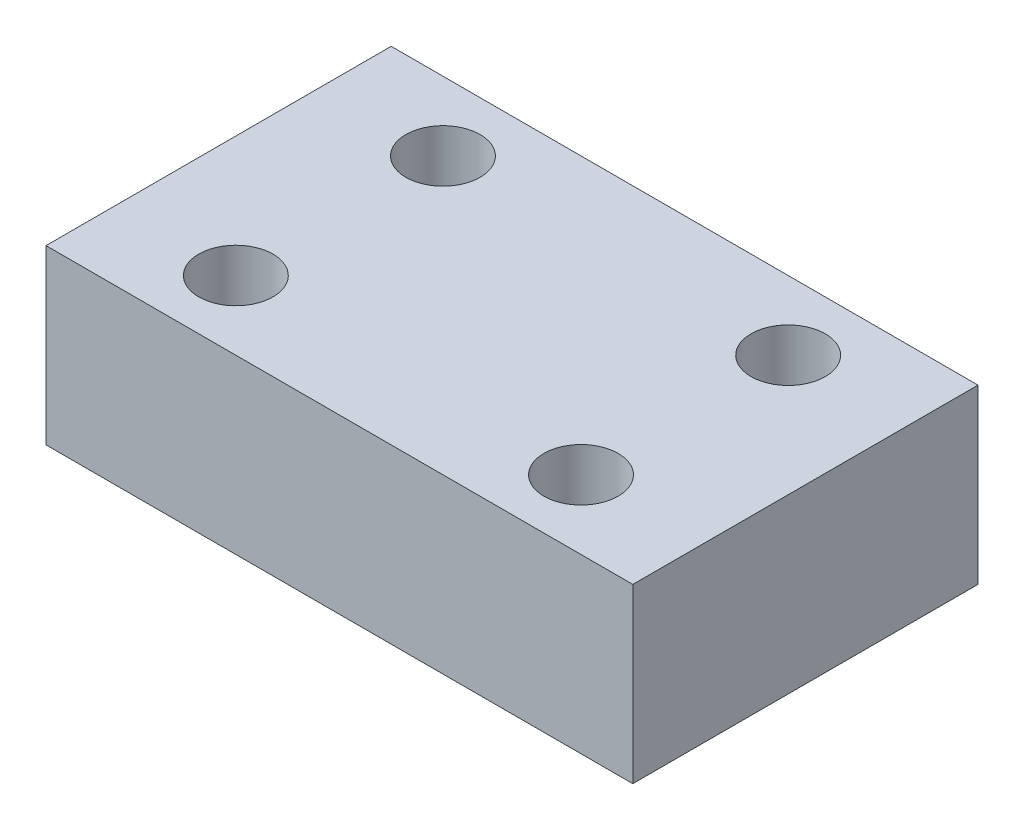
ISO-10303-21;
HEADER;
FILE_DESCRIPTION(('STEP AP214'),'2;1');
FILE_NAME('part.step','',(''),(''),'','','');
FILE_SCHEMA(('AUTOMOTIVE_DESIGN { 1 0 10303 214 1 1 1 1 }'));
ENDSEC;
DATA;
#1=APPLICATION_CONTEXT('core data for automotive mechanical design processes');
#2=APPLICATION_PROTOCOL_DEFINITION('international standard','automotive_design',2000,#1);
#3=PRODUCT_CONTEXT('',#1,'mechanical');
#4=PRODUCT('Part','Part','',(#3));
#5=PRODUCT_RELATED_PRODUCT_CATEGORY('part','',(#4));
#6=PRODUCT_DEFINITION_FORMATION('','',#4);
#7=PRODUCT_DEFINITION_CONTEXT('part definition',#1,'design');
#8=PRODUCT_DEFINITION('design','',#6,#7);
#9=PRODUCT_DEFINITION_SHAPE('','',#8);
#10=(LENGTH_UNIT() NAMED_UNIT(*) SI_UNIT(.MILLI.,.METRE.));
#11=(NAMED_UNIT(*) PLANE_ANGLE_UNIT() SI_UNIT($,.RADIAN.));
#12=(NAMED_UNIT(*) SI_UNIT($,.STERADIAN.) SOLID_ANGLE_UNIT());
#13=UNCERTAINTY_MEASURE_WITH_UNIT(LENGTH_MEASURE(1.E-05),#10,'distance_accuracy_value','');
#14=(GEOMETRIC_REPRESENTATION_CONTEXT(3) GLOBAL_UNCERTAINTY_ASSIGNED_CONTEXT((#13)) GLOBAL_UNIT_ASSIGNED_CONTEXT((#10,
#11,#12)) REPRESENTATION_CONTEXT('',''));
#15=CARTESIAN_POINT('',(0.,0.,0.));
#16=DIRECTION('',(0.,0.,1.));
#17=DIRECTION('',(1.,0.,0.));
#18=AXIS2_PLACEMENT_3D('',#15,#16,#17);
#19=CARTESIAN_POINT('',(-17.,-10.,-10.));
#20=DIRECTION('',(-1.,0.,0.));
#21=DIRECTION('',(0.,0.,1.));
#22=AXIS2_PLACEMENT_3D('',#19,#20,#21);
#23=PLANE('',#22);
#24=DIRECTION('',(0.,0.,1.));
#25=VECTOR('',#24,1.);
#26=CARTESIAN_POINT('',(-17.,0.,-10.));
#27=LINE('',#26,#25);
#28=CARTESIAN_POINT('',(-17.,0.,-10.));
#29=VERTEX_POINT('',#28);
#30=CARTESIAN_POINT('',(-17.,0.,10.));
#31=VERTEX_POINT('',#30);
#32=EDGE_CURVE('E102',#29,#31,#27,.T.);
#33=ORIENTED_EDGE('',*,*,#32,.F.);
#34=DIRECTION('',(0.,1.,0.));
#35=VECTOR('',#34,1.);
#36=CARTESIAN_POINT('',(-17.,-10.,-10.));
#37=LINE('',#36,#35);
#38=CARTESIAN_POINT('',(-17.,-10.,-10.));
#39=VERTEX_POINT('',#38);
#40=EDGE_CURVE('E11',#39,#29,#37,.T.);
#41=ORIENTED_EDGE('',*,*,#40,.F.);
#42=DIRECTION('',(0.,0.,1.));
#43=VECTOR('',#42,1.);
#44=CARTESIAN_POINT('',(-17.,-10.,-10.));
#45=LINE('',#44,#43);
#46=CARTESIAN_POINT('',(-17.,-10.,10.));
#47=VERTEX_POINT('',#46);
#48=EDGE_CURVE('E95',#39,#47,#45,.T.);
#49=ORIENTED_EDGE('',*,*,#48,.T.);
#50=DIRECTION('',(0.,1.,0.));
#51=VECTOR('',#50,1.);
#52=CARTESIAN_POINT('',(-17.,-10.,10.));
#53=LINE('',#52,#51);
#54=EDGE_CURVE('E40',#47,#31,#53,.T.);
#55=ORIENTED_EDGE('',*,*,#54,.T.);
#56=EDGE_LOOP('',(#33,#41,#49,#55));
#57=FACE_BOUND('',#56,.T.);
#58=ADVANCED_FACE('F37',(#57),#23,.T.);
#59=CARTESIAN_POINT('',(-17.,-10.,-10.));
#60=DIRECTION('',(0.,0.,-1.));
#61=DIRECTION('',(-1.,0.,0.));
#62=AXIS2_PLACEMENT_3D('',#59,#60,#61);
#63=PLANE('',#62);
#64=DIRECTION('',(-1.,0.,0.));
#65=VECTOR('',#64,1.);
#66=CARTESIAN_POINT('',(-17.,0.,-10.));
#67=LINE('',#66,#65);
#68=CARTESIAN_POINT('',(17.,0.,-10.));
#69=VERTEX_POINT('',#68);
#70=EDGE_CURVE('E97',#69,#29,#67,.T.);
#71=ORIENTED_EDGE('',*,*,#70,.F.);
#72=DIRECTION('',(0.,1.,0.));
#73=VECTOR('',#72,1.);
#74=CARTESIAN_POINT('',(17.,-10.,-10.));
#75=LINE('',#74,#73);
#76=CARTESIAN_POINT('',(17.,-10.,-10.));
#77=VERTEX_POINT('',#76);
#78=EDGE_CURVE('E46',#77,#69,#75,.T.);
#79=ORIENTED_EDGE('',*,*,#78,.F.);
#80=DIRECTION('',(-1.,0.,0.));
#81=VECTOR('',#80,1.);
#82=CARTESIAN_POINT('',(-17.,-10.,-10.));
#83=LINE('',#82,#81);
#84=EDGE_CURVE('E92',#77,#39,#83,.T.);
#85=ORIENTED_EDGE('',*,*,#84,.T.);
#86=ORIENTED_EDGE('',*,*,#40,.T.);
#87=EDGE_LOOP('',(#71,#79,#85,#86));
#88=FACE_BOUND('',#87,.T.);
#89=ADVANCED_FACE('F113',(#88),#63,.T.);
#90=CARTESIAN_POINT('',(17.,-10.,-10.));
#91=DIRECTION('',(1.,0.,0.));
#92=DIRECTION('',(0.,0.,-1.));
#93=AXIS2_PLACEMENT_3D('',#90,#91,#92);
#94=PLANE('',#93);
#95=DIRECTION('',(0.,0.,-1.));
#96=VECTOR('',#95,1.);
#97=CARTESIAN_POINT('',(17.,0.,-10.));
#98=LINE('',#97,#96);
#99=CARTESIAN_POINT('',(17.,0.,10.));
#100=VERTEX_POINT('',#99);
#101=EDGE_CURVE('E87',#100,#69,#98,.T.);
#102=ORIENTED_EDGE('',*,*,#101,.F.);
#103=DIRECTION('',(0.,1.,0.));
#104=VECTOR('',#103,1.);
#105=CARTESIAN_POINT('',(17.,-10.,10.));
#106=LINE('',#105,#104);
#107=CARTESIAN_POINT('',(17.,-10.,10.));
#108=VERTEX_POINT('',#107);
#109=EDGE_CURVE('E82',#108,#100,#106,.T.);
#110=ORIENTED_EDGE('',*,*,#109,.F.);
#111=DIRECTION('',(0.,0.,-1.));
#112=VECTOR('',#111,1.);
#113=CARTESIAN_POINT('',(17.,-10.,-10.));
#114=LINE('',#113,#112);
#115=EDGE_CURVE('E85',#108,#77,#114,.T.);
#116=ORIENTED_EDGE('',*,*,#115,.T.);
#117=ORIENTED_EDGE('',*,*,#78,.T.);
#118=EDGE_LOOP('',(#102,#110,#116,#117));
#119=FACE_BOUND('',#118,.T.);
#120=ADVANCED_FACE('F84',(#119),#94,.T.);
#121=CARTESIAN_POINT('',(-17.,-10.,10.));
#122=DIRECTION('',(0.,0.,1.));
#123=DIRECTION('',(1.,0.,0.));
#124=AXIS2_PLACEMENT_3D('',#121,#122,#123);
#125=PLANE('',#124);
#126=DIRECTION('',(1.,0.,0.));
#127=VECTOR('',#126,1.);
#128=CARTESIAN_POINT('',(-17.,0.,10.));
#129=LINE('',#128,#127);
#130=EDGE_CURVE('E105',#31,#100,#129,.T.);
#131=ORIENTED_EDGE('',*,*,#130,.F.);
#132=ORIENTED_EDGE('',*,*,#54,.F.);
#133=DIRECTION('',(1.,0.,0.));
#134=VECTOR('',#133,1.);
#135=CARTESIAN_POINT('',(-17.,-10.,10.));
#136=LINE('',#135,#134);
#137=EDGE_CURVE('E91',#47,#108,#136,.T.);
#138=ORIENTED_EDGE('',*,*,#137,.T.);
#139=ORIENTED_EDGE('',*,*,#109,.T.);
#140=EDGE_LOOP('',(#131,#132,#138,#139));
#141=FACE_BOUND('',#140,.T.);
#142=ADVANCED_FACE('F94',(#141),#125,.T.);
#143=CARTESIAN_POINT('',(0.,-10.,0.));
#144=DIRECTION('',(0.,1.,0.));
#145=DIRECTION('',(0.,0.,1.));
#146=AXIS2_PLACEMENT_3D('',#143,#144,#145);
#147=PLANE('',#146);
#148=CARTESIAN_POINT('',(-10.,-10.,-6.));
#149=DIRECTION('',(0.,1.,0.));
#150=DIRECTION('',(0.,0.,1.));
#151=AXIS2_PLACEMENT_3D('',#148,#149,#150);
#152=CIRCLE('',#151,2.15);
#153=CARTESIAN_POINT('',(-10.,-10.,-3.85));
#154=VERTEX_POINT('',#153);
#155=EDGE_CURVE('E154',#154,#154,#152,.T.);
#156=ORIENTED_EDGE('',*,*,#155,.T.);
#157=EDGE_LOOP('',(#156));
#158=FACE_BOUND('',#157,.T.);
#159=CARTESIAN_POINT('',(-10.,-10.,6.));
#160=DIRECTION('',(0.,1.,0.));
#161=DIRECTION('',(0.,0.,1.));
#162=AXIS2_PLACEMENT_3D('',#159,#160,#161);
#163=CIRCLE('',#162,2.15);
#164=CARTESIAN_POINT('',(-10.,-10.,8.15));
#165=VERTEX_POINT('',#164);
#166=EDGE_CURVE('E164',#165,#165,#163,.T.);
#167=ORIENTED_EDGE('',*,*,#166,.T.);
#168=EDGE_LOOP('',(#167));
#169=FACE_BOUND('',#168,.T.);
#170=CARTESIAN_POINT('',(10.,-10.,6.));
#171=DIRECTION('',(0.,1.,0.));
#172=DIRECTION('',(0.,0.,1.));
#173=AXIS2_PLACEMENT_3D('',#170,#171,#172);
#174=CIRCLE('',#173,2.15);
#175=CARTESIAN_POINT('',(10.,-10.,8.15));
#176=VERTEX_POINT('',#175);
#177=EDGE_CURVE('E170',#176,#176,#174,.T.);
#178=ORIENTED_EDGE('',*,*,#177,.T.);
#179=EDGE_LOOP('',(#178));
#180=FACE_BOUND('',#179,.T.);
#181=CARTESIAN_POINT('',(10.,-10.,-6.));
#182=DIRECTION('',(0.,1.,0.));
#183=DIRECTION('',(0.,0.,1.));
#184=AXIS2_PLACEMENT_3D('',#181,#182,#183);
#185=CIRCLE('',#184,2.15);
#186=CARTESIAN_POINT('',(10.,-10.,-3.85));
#187=VERTEX_POINT('',#186);
#188=EDGE_CURVE('E106',#187,#187,#185,.T.);
#189=ORIENTED_EDGE('',*,*,#188,.T.);
#190=EDGE_LOOP('',(#189));
#191=FACE_BOUND('',#190,.T.);
#192=ORIENTED_EDGE('',*,*,#48,.F.);
#193=ORIENTED_EDGE('',*,*,#84,.F.);
#194=ORIENTED_EDGE('',*,*,#115,.F.);
#195=ORIENTED_EDGE('',*,*,#137,.F.);
#196=EDGE_LOOP('',(#192,#193,#194,#195));
#197=FACE_BOUND('',#196,.T.);
#198=ADVANCED_FACE('F90',(#158,#169,#180,#191,#197),#147,.F.);
#199=CARTESIAN_POINT('',(0.,0.,0.));
#200=DIRECTION('',(0.,1.,0.));
#201=DIRECTION('',(0.,0.,1.));
#202=AXIS2_PLACEMENT_3D('',#199,#200,#201);
#203=PLANE('',#202);
#204=CARTESIAN_POINT('',(-10.,0.,-6.));
#205=DIRECTION('',(0.,1.,0.));
#206=DIRECTION('',(0.,0.,1.));
#207=AXIS2_PLACEMENT_3D('',#204,#205,#206);
#208=CIRCLE('',#207,2.14999999999999);
#209=CARTESIAN_POINT('',(-10.,0.,-3.85000000000001));
#210=VERTEX_POINT('',#209);
#211=EDGE_CURVE('E157',#210,#210,#208,.T.);
#212=ORIENTED_EDGE('',*,*,#211,.F.);
#213=EDGE_LOOP('',(#212));
#214=FACE_BOUND('',#213,.T.);
#215=CARTESIAN_POINT('',(-10.,0.,6.));
#216=DIRECTION('',(0.,1.,0.));
#217=DIRECTION('',(0.,0.,1.));
#218=AXIS2_PLACEMENT_3D('',#215,#216,#217);
#219=CIRCLE('',#218,2.14999999999999);
#220=CARTESIAN_POINT('',(-10.,0.,8.14999999999999));
#221=VERTEX_POINT('',#220);
#222=EDGE_CURVE('E159',#221,#221,#219,.T.);
#223=ORIENTED_EDGE('',*,*,#222,.F.);
#224=EDGE_LOOP('',(#223));
#225=FACE_BOUND('',#224,.T.);
#226=CARTESIAN_POINT('',(10.,0.,6.));
#227=DIRECTION('',(0.,1.,0.));
#228=DIRECTION('',(0.,0.,1.));
#229=AXIS2_PLACEMENT_3D('',#226,#227,#228);
#230=CIRCLE('',#229,2.14999999999999);
#231=CARTESIAN_POINT('',(10.,0.,8.14999999999999));
#232=VERTEX_POINT('',#231);
#233=EDGE_CURVE('E167',#232,#232,#230,.T.);
#234=ORIENTED_EDGE('',*,*,#233,.F.);
#235=EDGE_LOOP('',(#234));
#236=FACE_BOUND('',#235,.T.);
#237=CARTESIAN_POINT('',(10.,0.,-6.));
#238=DIRECTION('',(0.,1.,0.));
#239=DIRECTION('',(0.,0.,1.));
#240=AXIS2_PLACEMENT_3D('',#237,#238,#239);
#241=CIRCLE('',#240,2.14999999999999);
#242=CARTESIAN_POINT('',(10.,0.,-3.85000000000001));
#243=VERTEX_POINT('',#242);
#244=EDGE_CURVE('E173',#243,#243,#241,.T.);
#245=ORIENTED_EDGE('',*,*,#244,.F.);
#246=EDGE_LOOP('',(#245));
#247=FACE_BOUND('',#246,.T.);
#248=ORIENTED_EDGE('',*,*,#32,.T.);
#249=ORIENTED_EDGE('',*,*,#130,.T.);
#250=ORIENTED_EDGE('',*,*,#101,.T.);
#251=ORIENTED_EDGE('',*,*,#70,.T.);
#252=EDGE_LOOP('',(#248,#249,#250,#251));
#253=FACE_BOUND('',#252,.T.);
#254=ADVANCED_FACE('F112',(#214,#225,#236,#247,#253),#203,.T.);
#255=CARTESIAN_POINT('',(10.,0.,-6.));
#256=DIRECTION('',(0.,1.,0.));
#257=DIRECTION('',(0.,0.,1.));
#258=AXIS2_PLACEMENT_3D('',#255,#256,#257);
#259=CYLINDRICAL_SURFACE('',#258,2.14999999999999);
#260=ORIENTED_EDGE('',*,*,#188,.F.);
#261=EDGE_LOOP('',(#260));
#262=FACE_BOUND('',#261,.T.);
#263=ORIENTED_EDGE('',*,*,#244,.T.);
#264=EDGE_LOOP('',(#263));
#265=FACE_BOUND('',#264,.T.);
#266=ADVANCED_FACE('F131',(#262,#265),#259,.F.);
#267=CARTESIAN_POINT('',(10.,0.,6.));
#268=DIRECTION('',(0.,1.,0.));
#269=DIRECTION('',(0.,0.,1.));
#270=AXIS2_PLACEMENT_3D('',#267,#268,#269);
#271=CYLINDRICAL_SURFACE('',#270,2.14999999999999);
#272=ORIENTED_EDGE('',*,*,#177,.F.);
#273=EDGE_LOOP('',(#272));
#274=FACE_BOUND('',#273,.T.);
#275=ORIENTED_EDGE('',*,*,#233,.T.);
#276=EDGE_LOOP('',(#275));
#277=FACE_BOUND('',#276,.T.);
#278=ADVANCED_FACE('F138',(#274,#277),#271,.F.);
#279=CARTESIAN_POINT('',(-10.,0.,6.));
#280=DIRECTION('',(0.,1.,0.));
#281=DIRECTION('',(0.,0.,1.));
#282=AXIS2_PLACEMENT_3D('',#279,#280,#281);
#283=CYLINDRICAL_SURFACE('',#282,2.14999999999999);
#284=ORIENTED_EDGE('',*,*,#166,.F.);
#285=EDGE_LOOP('',(#284));
#286=FACE_BOUND('',#285,.T.);
#287=ORIENTED_EDGE('',*,*,#222,.T.);
#288=EDGE_LOOP('',(#287));
#289=FACE_BOUND('',#288,.T.);
#290=ADVANCED_FACE('F142',(#286,#289),#283,.F.);
#291=CARTESIAN_POINT('',(-10.,0.,-6.));
#292=DIRECTION('',(0.,1.,0.));
#293=DIRECTION('',(0.,0.,1.));
#294=AXIS2_PLACEMENT_3D('',#291,#292,#293);
#295=CYLINDRICAL_SURFACE('',#294,2.14999999999999);
#296=ORIENTED_EDGE('',*,*,#155,.F.);
#297=EDGE_LOOP('',(#296));
#298=FACE_BOUND('',#297,.T.);
#299=ORIENTED_EDGE('',*,*,#211,.T.);
#300=EDGE_LOOP('',(#299));
#301=FACE_BOUND('',#300,.T.);
#302=ADVANCED_FACE('F146',(#298,#301),#295,.F.);
#303=CLOSED_SHELL('',(#58,#89,#120,#142,#198,#254,#266,#278,#290,#302));
#304=MANIFOLD_SOLID_BREP('B2',#303);
#305=ADVANCED_BREP_SHAPE_REPRESENTATION('',(#18,#304),#14);
#306=SHAPE_DEFINITION_REPRESENTATION(#9,#305);
ENDSEC;
END-ISO-10303-21;
